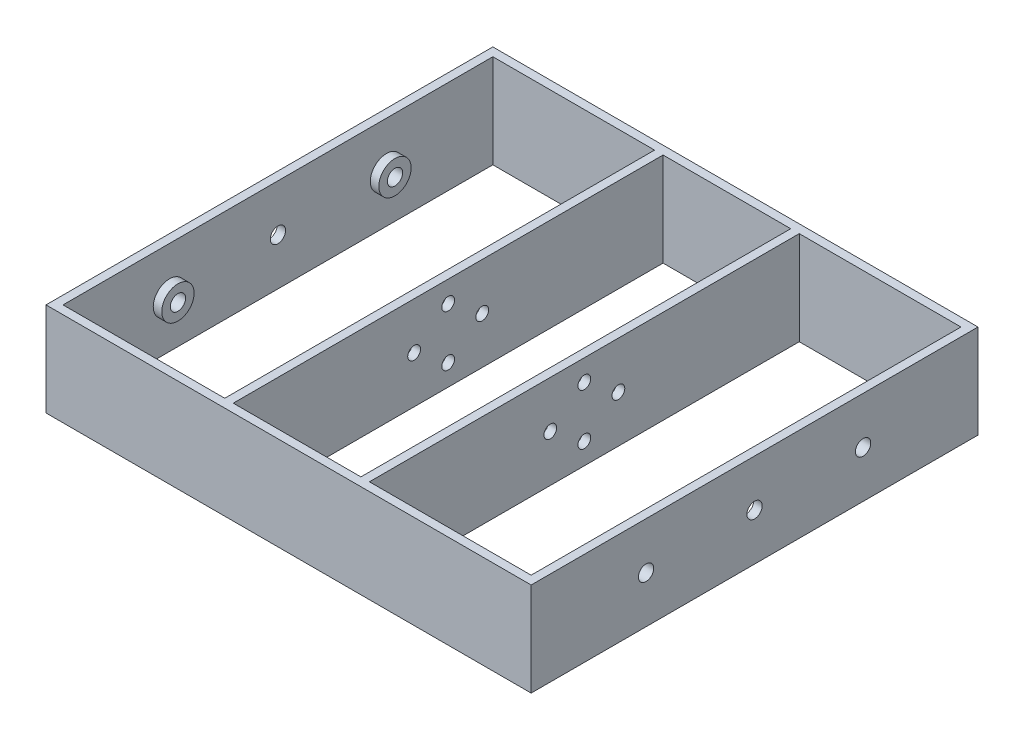
ISO-10303-21;
HEADER;
FILE_DESCRIPTION(('STEP AP214'),'2;1');
FILE_NAME('part.step','',(''),(''),'','','');
FILE_SCHEMA(('AUTOMOTIVE_DESIGN { 1 0 10303 214 1 1 1 1 }'));
ENDSEC;
DATA;
#1=APPLICATION_CONTEXT('core data for automotive mechanical design processes');
#2=APPLICATION_PROTOCOL_DEFINITION('international standard','automotive_design',2000,#1);
#3=PRODUCT_CONTEXT('',#1,'mechanical');
#4=PRODUCT('Part','Part','',(#3));
#5=PRODUCT_RELATED_PRODUCT_CATEGORY('part','',(#4));
#6=PRODUCT_DEFINITION_FORMATION('','',#4);
#7=PRODUCT_DEFINITION_CONTEXT('part definition',#1,'design');
#8=PRODUCT_DEFINITION('design','',#6,#7);
#9=PRODUCT_DEFINITION_SHAPE('','',#8);
#10=(LENGTH_UNIT() NAMED_UNIT(*) SI_UNIT(.MILLI.,.METRE.));
#11=(NAMED_UNIT(*) PLANE_ANGLE_UNIT() SI_UNIT($,.RADIAN.));
#12=(NAMED_UNIT(*) SI_UNIT($,.STERADIAN.) SOLID_ANGLE_UNIT());
#13=UNCERTAINTY_MEASURE_WITH_UNIT(LENGTH_MEASURE(1.E-05),#10,'distance_accuracy_value','');
#14=(GEOMETRIC_REPRESENTATION_CONTEXT(3) GLOBAL_UNCERTAINTY_ASSIGNED_CONTEXT((#13)) GLOBAL_UNIT_ASSIGNED_CONTEXT((#10,
#11,#12)) REPRESENTATION_CONTEXT('',''));
#15=CARTESIAN_POINT('',(0.,0.,0.));
#16=DIRECTION('',(0.,0.,1.));
#17=DIRECTION('',(1.,0.,0.));
#18=AXIS2_PLACEMENT_3D('',#15,#16,#17);
#19=CARTESIAN_POINT('',(-55.,0.,0.));
#20=DIRECTION('',(1.,0.,0.));
#21=DIRECTION('',(0.,0.,1.));
#22=AXIS2_PLACEMENT_3D('',#19,#20,#21);
#23=PLANE('',#22);
#24=CARTESIAN_POINT('',(-55.,0.,-25.5));
#25=DIRECTION('',(-1.,0.,0.));
#26=DIRECTION('',(0.,0.,1.));
#27=AXIS2_PLACEMENT_3D('',#24,#25,#26);
#28=CIRCLE('',#27,3.8);
#29=CARTESIAN_POINT('',(-55.,0.,-21.7));
#30=VERTEX_POINT('',#29);
#31=EDGE_CURVE('E288',#30,#30,#28,.T.);
#32=ORIENTED_EDGE('',*,*,#31,.T.);
#33=EDGE_LOOP('',(#32));
#34=FACE_BOUND('',#33,.T.);
#35=CARTESIAN_POINT('',(-55.,0.,0.));
#36=DIRECTION('',(1.,0.,0.));
#37=DIRECTION('',(0.,0.,-1.));
#38=AXIS2_PLACEMENT_3D('',#35,#36,#37);
#39=CIRCLE('',#38,1.8);
#40=CARTESIAN_POINT('',(-55.,0.,-1.8));
#41=VERTEX_POINT('',#40);
#42=EDGE_CURVE('E300',#41,#41,#39,.T.);
#43=ORIENTED_EDGE('',*,*,#42,.F.);
#44=EDGE_LOOP('',(#43));
#45=FACE_BOUND('',#44,.T.);
#46=CARTESIAN_POINT('',(-55.,0.,25.5));
#47=DIRECTION('',(-1.,0.,0.));
#48=DIRECTION('',(0.,0.,1.));
#49=AXIS2_PLACEMENT_3D('',#46,#47,#48);
#50=CIRCLE('',#49,3.8);
#51=CARTESIAN_POINT('',(-55.,0.,29.3));
#52=VERTEX_POINT('',#51);
#53=EDGE_CURVE('E279',#52,#52,#50,.T.);
#54=ORIENTED_EDGE('',*,*,#53,.T.);
#55=EDGE_LOOP('',(#54));
#56=FACE_BOUND('',#55,.T.);
#57=DIRECTION('',(0.,0.,-1.));
#58=VECTOR('',#57,1.);
#59=CARTESIAN_POINT('',(-55.,-11.,-52.5));
#60=LINE('',#59,#58);
#61=CARTESIAN_POINT('',(-55.,-11.,50.5));
#62=VERTEX_POINT('',#61);
#63=CARTESIAN_POINT('',(-55.,-11.,-50.5));
#64=VERTEX_POINT('',#63);
#65=EDGE_CURVE('E48',#62,#64,#60,.T.);
#66=ORIENTED_EDGE('',*,*,#65,.T.);
#67=DIRECTION('',(0.,1.,0.));
#68=VECTOR('',#67,1.);
#69=CARTESIAN_POINT('',(-55.,0.,-50.5));
#70=LINE('',#69,#68);
#71=CARTESIAN_POINT('',(-55.,11.,-50.5));
#72=VERTEX_POINT('',#71);
#73=EDGE_CURVE('E52',#64,#72,#70,.T.);
#74=ORIENTED_EDGE('',*,*,#73,.T.);
#75=DIRECTION('',(0.,0.,1.));
#76=VECTOR('',#75,1.);
#77=CARTESIAN_POINT('',(-55.,11.,-52.5));
#78=LINE('',#77,#76);
#79=CARTESIAN_POINT('',(-55.,11.,50.5));
#80=VERTEX_POINT('',#79);
#81=EDGE_CURVE('E310',#72,#80,#78,.T.);
#82=ORIENTED_EDGE('',*,*,#81,.T.);
#83=DIRECTION('',(0.,-1.,0.));
#84=VECTOR('',#83,1.);
#85=CARTESIAN_POINT('',(-55.,0.,50.5));
#86=LINE('',#85,#84);
#87=EDGE_CURVE('E274',#80,#62,#86,.T.);
#88=ORIENTED_EDGE('',*,*,#87,.T.);
#89=EDGE_LOOP('',(#66,#74,#82,#88));
#90=FACE_BOUND('',#89,.T.);
#91=ADVANCED_FACE('F33',(#34,#45,#56,#90),#23,.T.);
#92=CARTESIAN_POINT('',(55.,0.,0.));
#93=DIRECTION('',(-1.,0.,0.));
#94=DIRECTION('',(0.,0.,1.));
#95=AXIS2_PLACEMENT_3D('',#92,#93,#94);
#96=PLANE('',#95);
#97=CARTESIAN_POINT('',(55.,0.,25.5));
#98=DIRECTION('',(-1.,0.,0.));
#99=DIRECTION('',(0.,0.,1.));
#100=AXIS2_PLACEMENT_3D('',#97,#98,#99);
#101=CIRCLE('',#100,3.8);
#102=CARTESIAN_POINT('',(55.,0.,29.3));
#103=VERTEX_POINT('',#102);
#104=EDGE_CURVE('E221',#103,#103,#101,.T.);
#105=ORIENTED_EDGE('',*,*,#104,.F.);
#106=EDGE_LOOP('',(#105));
#107=FACE_BOUND('',#106,.T.);
#108=CARTESIAN_POINT('',(55.,0.,0.));
#109=DIRECTION('',(1.,0.,0.));
#110=DIRECTION('',(0.,0.,-1.));
#111=AXIS2_PLACEMENT_3D('',#108,#109,#110);
#112=CIRCLE('',#111,1.8);
#113=CARTESIAN_POINT('',(55.,0.,-1.8));
#114=VERTEX_POINT('',#113);
#115=EDGE_CURVE('E242',#114,#114,#112,.T.);
#116=ORIENTED_EDGE('',*,*,#115,.T.);
#117=EDGE_LOOP('',(#116));
#118=FACE_BOUND('',#117,.T.);
#119=CARTESIAN_POINT('',(55.,0.,-25.5));
#120=DIRECTION('',(-1.,0.,0.));
#121=DIRECTION('',(0.,0.,1.));
#122=AXIS2_PLACEMENT_3D('',#119,#120,#121);
#123=CIRCLE('',#122,3.8);
#124=CARTESIAN_POINT('',(55.,0.,-21.7));
#125=VERTEX_POINT('',#124);
#126=EDGE_CURVE('E230',#125,#125,#123,.T.);
#127=ORIENTED_EDGE('',*,*,#126,.F.);
#128=EDGE_LOOP('',(#127));
#129=FACE_BOUND('',#128,.T.);
#130=DIRECTION('',(0.,0.,1.));
#131=VECTOR('',#130,1.);
#132=CARTESIAN_POINT('',(55.,11.,-52.5));
#133=LINE('',#132,#131);
#134=CARTESIAN_POINT('',(55.,11.,-50.5));
#135=VERTEX_POINT('',#134);
#136=CARTESIAN_POINT('',(55.,11.,50.5));
#137=VERTEX_POINT('',#136);
#138=EDGE_CURVE('E253',#135,#137,#133,.T.);
#139=ORIENTED_EDGE('',*,*,#138,.F.);
#140=DIRECTION('',(0.,-1.,0.));
#141=VECTOR('',#140,1.);
#142=CARTESIAN_POINT('',(55.,0.,-50.5));
#143=LINE('',#142,#141);
#144=CARTESIAN_POINT('',(55.,-11.,-50.5));
#145=VERTEX_POINT('',#144);
#146=EDGE_CURVE('E357',#135,#145,#143,.T.);
#147=ORIENTED_EDGE('',*,*,#146,.T.);
#148=DIRECTION('',(0.,0.,-1.));
#149=VECTOR('',#148,1.);
#150=CARTESIAN_POINT('',(55.,-11.,-52.5));
#151=LINE('',#150,#149);
#152=CARTESIAN_POINT('',(55.,-11.,50.5));
#153=VERTEX_POINT('',#152);
#154=EDGE_CURVE('E246',#153,#145,#151,.T.);
#155=ORIENTED_EDGE('',*,*,#154,.F.);
#156=DIRECTION('',(0.,-1.,0.));
#157=VECTOR('',#156,1.);
#158=CARTESIAN_POINT('',(55.,11.,50.5));
#159=LINE('',#158,#157);
#160=EDGE_CURVE('E327',#137,#153,#159,.T.);
#161=ORIENTED_EDGE('',*,*,#160,.F.);
#162=EDGE_LOOP('',(#139,#147,#155,#161));
#163=FACE_BOUND('',#162,.T.);
#164=ADVANCED_FACE('F349',(#107,#118,#129,#163),#96,.T.);
#165=CARTESIAN_POINT('',(17.,0.,0.));
#166=DIRECTION('',(1.,0.,0.));
#167=DIRECTION('',(0.,0.,-1.));
#168=AXIS2_PLACEMENT_3D('',#165,#166,#167);
#169=PLANE('',#168);
#170=CARTESIAN_POINT('',(17.,-6.,0.));
#171=DIRECTION('',(1.,0.,0.));
#172=DIRECTION('',(0.,0.,-1.));
#173=AXIS2_PLACEMENT_3D('',#170,#171,#172);
#174=CIRCLE('',#173,1.5);
#175=CARTESIAN_POINT('',(17.,-6.,-1.5));
#176=VERTEX_POINT('',#175);
#177=EDGE_CURVE('E186',#176,#176,#174,.T.);
#178=ORIENTED_EDGE('',*,*,#177,.F.);
#179=EDGE_LOOP('',(#178));
#180=FACE_BOUND('',#179,.T.);
#181=CARTESIAN_POINT('',(17.,0.,8.));
#182=DIRECTION('',(1.,0.,0.));
#183=DIRECTION('',(0.,0.,-1.));
#184=AXIS2_PLACEMENT_3D('',#181,#182,#183);
#185=CIRCLE('',#184,1.5);
#186=CARTESIAN_POINT('',(17.,0.,6.5));
#187=VERTEX_POINT('',#186);
#188=EDGE_CURVE('E198',#187,#187,#185,.T.);
#189=ORIENTED_EDGE('',*,*,#188,.F.);
#190=EDGE_LOOP('',(#189));
#191=FACE_BOUND('',#190,.T.);
#192=CARTESIAN_POINT('',(17.,0.,-8.));
#193=DIRECTION('',(1.,0.,0.));
#194=DIRECTION('',(0.,0.,-1.));
#195=AXIS2_PLACEMENT_3D('',#192,#193,#194);
#196=CIRCLE('',#195,1.5);
#197=CARTESIAN_POINT('',(17.,0.,-9.5));
#198=VERTEX_POINT('',#197);
#199=EDGE_CURVE('E204',#198,#198,#196,.T.);
#200=ORIENTED_EDGE('',*,*,#199,.F.);
#201=EDGE_LOOP('',(#200));
#202=FACE_BOUND('',#201,.T.);
#203=CARTESIAN_POINT('',(17.,6.,0.));
#204=DIRECTION('',(1.,0.,0.));
#205=DIRECTION('',(0.,0.,-1.));
#206=AXIS2_PLACEMENT_3D('',#203,#204,#205);
#207=CIRCLE('',#206,1.5);
#208=CARTESIAN_POINT('',(17.,6.,-1.5));
#209=VERTEX_POINT('',#208);
#210=EDGE_CURVE('E192',#209,#209,#207,.T.);
#211=ORIENTED_EDGE('',*,*,#210,.F.);
#212=EDGE_LOOP('',(#211));
#213=FACE_BOUND('',#212,.T.);
#214=DIRECTION('',(0.,0.,-1.));
#215=VECTOR('',#214,1.);
#216=CARTESIAN_POINT('',(17.,-11.,-52.5));
#217=LINE('',#216,#215);
#218=CARTESIAN_POINT('',(17.,-11.,50.5));
#219=VERTEX_POINT('',#218);
#220=CARTESIAN_POINT('',(17.,-11.,-50.5));
#221=VERTEX_POINT('',#220);
#222=EDGE_CURVE('E210',#219,#221,#217,.T.);
#223=ORIENTED_EDGE('',*,*,#222,.T.);
#224=DIRECTION('',(0.,1.,0.));
#225=VECTOR('',#224,1.);
#226=CARTESIAN_POINT('',(17.,0.,-50.5));
#227=LINE('',#226,#225);
#228=CARTESIAN_POINT('',(17.,11.,-50.5));
#229=VERTEX_POINT('',#228);
#230=EDGE_CURVE('E354',#221,#229,#227,.T.);
#231=ORIENTED_EDGE('',*,*,#230,.T.);
#232=DIRECTION('',(0.,0.,1.));
#233=VECTOR('',#232,1.);
#234=CARTESIAN_POINT('',(17.,11.,-52.5));
#235=LINE('',#234,#233);
#236=CARTESIAN_POINT('',(17.,11.,50.5));
#237=VERTEX_POINT('',#236);
#238=EDGE_CURVE('E212',#229,#237,#235,.T.);
#239=ORIENTED_EDGE('',*,*,#238,.T.);
#240=DIRECTION('',(0.,1.,0.));
#241=VECTOR('',#240,1.);
#242=CARTESIAN_POINT('',(17.,11.,50.5));
#243=LINE('',#242,#241);
#244=EDGE_CURVE('E41',#219,#237,#243,.T.);
#245=ORIENTED_EDGE('',*,*,#244,.F.);
#246=EDGE_LOOP('',(#223,#231,#239,#245));
#247=FACE_BOUND('',#246,.T.);
#248=ADVANCED_FACE('F353',(#180,#191,#202,#213,#247),#169,.T.);
#249=CARTESIAN_POINT('',(15.,0.,0.));
#250=DIRECTION('',(1.,0.,0.));
#251=DIRECTION('',(0.,0.,-1.));
#252=AXIS2_PLACEMENT_3D('',#249,#250,#251);
#253=PLANE('',#252);
#254=CARTESIAN_POINT('',(15.,-6.,0.));
#255=DIRECTION('',(1.,0.,0.));
#256=DIRECTION('',(0.,0.,-1.));
#257=AXIS2_PLACEMENT_3D('',#254,#255,#256);
#258=CIRCLE('',#257,1.5);
#259=CARTESIAN_POINT('',(15.,-6.,-1.5));
#260=VERTEX_POINT('',#259);
#261=EDGE_CURVE('E185',#260,#260,#258,.T.);
#262=ORIENTED_EDGE('',*,*,#261,.T.);
#263=EDGE_LOOP('',(#262));
#264=FACE_BOUND('',#263,.T.);
#265=CARTESIAN_POINT('',(15.,6.,0.));
#266=DIRECTION('',(1.,0.,0.));
#267=DIRECTION('',(0.,0.,-1.));
#268=AXIS2_PLACEMENT_3D('',#265,#266,#267);
#269=CIRCLE('',#268,1.5);
#270=CARTESIAN_POINT('',(15.,6.,-1.5));
#271=VERTEX_POINT('',#270);
#272=EDGE_CURVE('E189',#271,#271,#269,.T.);
#273=ORIENTED_EDGE('',*,*,#272,.T.);
#274=EDGE_LOOP('',(#273));
#275=FACE_BOUND('',#274,.T.);
#276=CARTESIAN_POINT('',(15.,0.,8.));
#277=DIRECTION('',(1.,0.,0.));
#278=DIRECTION('',(0.,0.,-1.));
#279=AXIS2_PLACEMENT_3D('',#276,#277,#278);
#280=CIRCLE('',#279,1.5);
#281=CARTESIAN_POINT('',(15.,0.,6.5));
#282=VERTEX_POINT('',#281);
#283=EDGE_CURVE('E195',#282,#282,#280,.T.);
#284=ORIENTED_EDGE('',*,*,#283,.T.);
#285=EDGE_LOOP('',(#284));
#286=FACE_BOUND('',#285,.T.);
#287=CARTESIAN_POINT('',(15.,0.,-8.));
#288=DIRECTION('',(1.,0.,0.));
#289=DIRECTION('',(0.,0.,-1.));
#290=AXIS2_PLACEMENT_3D('',#287,#288,#289);
#291=CIRCLE('',#290,1.5);
#292=CARTESIAN_POINT('',(15.,0.,-9.5));
#293=VERTEX_POINT('',#292);
#294=EDGE_CURVE('E201',#293,#293,#291,.T.);
#295=ORIENTED_EDGE('',*,*,#294,.T.);
#296=EDGE_LOOP('',(#295));
#297=FACE_BOUND('',#296,.T.);
#298=DIRECTION('',(0.,1.,0.));
#299=VECTOR('',#298,1.);
#300=CARTESIAN_POINT('',(15.,0.,-50.5));
#301=LINE('',#300,#299);
#302=CARTESIAN_POINT('',(15.,-11.,-50.5));
#303=VERTEX_POINT('',#302);
#304=CARTESIAN_POINT('',(15.,11.,-50.5));
#305=VERTEX_POINT('',#304);
#306=EDGE_CURVE('E163',#303,#305,#301,.T.);
#307=ORIENTED_EDGE('',*,*,#306,.F.);
#308=DIRECTION('',(0.,0.,-1.));
#309=VECTOR('',#308,1.);
#310=CARTESIAN_POINT('',(15.,-11.,-52.5));
#311=LINE('',#310,#309);
#312=CARTESIAN_POINT('',(15.,-11.,50.5));
#313=VERTEX_POINT('',#312);
#314=EDGE_CURVE('E207',#313,#303,#311,.T.);
#315=ORIENTED_EDGE('',*,*,#314,.F.);
#316=DIRECTION('',(0.,1.,0.));
#317=VECTOR('',#316,1.);
#318=CARTESIAN_POINT('',(15.,11.,50.5));
#319=LINE('',#318,#317);
#320=CARTESIAN_POINT('',(15.,11.,50.5));
#321=VERTEX_POINT('',#320);
#322=EDGE_CURVE('E330',#313,#321,#319,.T.);
#323=ORIENTED_EDGE('',*,*,#322,.T.);
#324=DIRECTION('',(0.,0.,1.));
#325=VECTOR('',#324,1.);
#326=CARTESIAN_POINT('',(15.,11.,-52.5));
#327=LINE('',#326,#325);
#328=EDGE_CURVE('E213',#305,#321,#327,.T.);
#329=ORIENTED_EDGE('',*,*,#328,.F.);
#330=EDGE_LOOP('',(#307,#315,#323,#329));
#331=FACE_BOUND('',#330,.T.);
#332=ADVANCED_FACE('F410',(#264,#275,#286,#297,#331),#253,.F.);
#333=CARTESIAN_POINT('',(-17.,0.,0.));
#334=DIRECTION('',(-1.,0.,0.));
#335=DIRECTION('',(0.,0.,-1.));
#336=AXIS2_PLACEMENT_3D('',#333,#334,#335);
#337=PLANE('',#336);
#338=CARTESIAN_POINT('',(-17.,-6.,0.));
#339=DIRECTION('',(1.,0.,0.));
#340=DIRECTION('',(0.,0.,-1.));
#341=AXIS2_PLACEMENT_3D('',#338,#339,#340);
#342=CIRCLE('',#341,1.5);
#343=CARTESIAN_POINT('',(-17.,-6.,-1.5));
#344=VERTEX_POINT('',#343);
#345=EDGE_CURVE('E364',#344,#344,#342,.T.);
#346=ORIENTED_EDGE('',*,*,#345,.T.);
#347=EDGE_LOOP('',(#346));
#348=FACE_BOUND('',#347,.T.);
#349=CARTESIAN_POINT('',(-17.,0.,8.));
#350=DIRECTION('',(1.,0.,0.));
#351=DIRECTION('',(0.,0.,-1.));
#352=AXIS2_PLACEMENT_3D('',#349,#350,#351);
#353=CIRCLE('',#352,1.5);
#354=CARTESIAN_POINT('',(-17.,0.,6.5));
#355=VERTEX_POINT('',#354);
#356=EDGE_CURVE('E376',#355,#355,#353,.T.);
#357=ORIENTED_EDGE('',*,*,#356,.T.);
#358=EDGE_LOOP('',(#357));
#359=FACE_BOUND('',#358,.T.);
#360=CARTESIAN_POINT('',(-17.,0.,-8.));
#361=DIRECTION('',(1.,0.,0.));
#362=DIRECTION('',(0.,0.,-1.));
#363=AXIS2_PLACEMENT_3D('',#360,#361,#362);
#364=CIRCLE('',#363,1.5);
#365=CARTESIAN_POINT('',(-17.,0.,-9.5));
#366=VERTEX_POINT('',#365);
#367=EDGE_CURVE('E180',#366,#366,#364,.T.);
#368=ORIENTED_EDGE('',*,*,#367,.T.);
#369=EDGE_LOOP('',(#368));
#370=FACE_BOUND('',#369,.T.);
#371=CARTESIAN_POINT('',(-17.,6.,0.));
#372=DIRECTION('',(1.,0.,0.));
#373=DIRECTION('',(0.,0.,-1.));
#374=AXIS2_PLACEMENT_3D('',#371,#372,#373);
#375=CIRCLE('',#374,1.5);
#376=CARTESIAN_POINT('',(-17.,6.,-1.5));
#377=VERTEX_POINT('',#376);
#378=EDGE_CURVE('E370',#377,#377,#375,.T.);
#379=ORIENTED_EDGE('',*,*,#378,.T.);
#380=EDGE_LOOP('',(#379));
#381=FACE_BOUND('',#380,.T.);
#382=DIRECTION('',(0.,0.,1.));
#383=VECTOR('',#382,1.);
#384=CARTESIAN_POINT('',(-17.,11.,-52.5));
#385=LINE('',#384,#383);
#386=CARTESIAN_POINT('',(-17.,11.,-50.5));
#387=VERTEX_POINT('',#386);
#388=CARTESIAN_POINT('',(-17.,11.,50.5));
#389=VERTEX_POINT('',#388);
#390=EDGE_CURVE('E162',#387,#389,#385,.T.);
#391=ORIENTED_EDGE('',*,*,#390,.F.);
#392=DIRECTION('',(0.,-1.,0.));
#393=VECTOR('',#392,1.);
#394=CARTESIAN_POINT('',(-17.,0.,-50.5));
#395=LINE('',#394,#393);
#396=CARTESIAN_POINT('',(-17.,-11.,-50.5));
#397=VERTEX_POINT('',#396);
#398=EDGE_CURVE('E148',#387,#397,#395,.T.);
#399=ORIENTED_EDGE('',*,*,#398,.T.);
#400=DIRECTION('',(0.,0.,-1.));
#401=VECTOR('',#400,1.);
#402=CARTESIAN_POINT('',(-17.,-11.,-52.5));
#403=LINE('',#402,#401);
#404=CARTESIAN_POINT('',(-17.,-11.,50.5));
#405=VERTEX_POINT('',#404);
#406=EDGE_CURVE('E160',#405,#397,#403,.T.);
#407=ORIENTED_EDGE('',*,*,#406,.F.);
#408=DIRECTION('',(0.,-1.,0.));
#409=VECTOR('',#408,1.);
#410=CARTESIAN_POINT('',(-17.,11.,50.5));
#411=LINE('',#410,#409);
#412=EDGE_CURVE('E183',#389,#405,#411,.T.);
#413=ORIENTED_EDGE('',*,*,#412,.F.);
#414=EDGE_LOOP('',(#391,#399,#407,#413));
#415=FACE_BOUND('',#414,.T.);
#416=ADVANCED_FACE('F158',(#348,#359,#370,#381,#415),#337,.T.);
#417=CARTESIAN_POINT('',(-15.,0.,0.));
#418=DIRECTION('',(-1.,0.,0.));
#419=DIRECTION('',(0.,0.,-1.));
#420=AXIS2_PLACEMENT_3D('',#417,#418,#419);
#421=PLANE('',#420);
#422=CARTESIAN_POINT('',(-15.,-6.,0.));
#423=DIRECTION('',(1.,0.,0.));
#424=DIRECTION('',(0.,0.,-1.));
#425=AXIS2_PLACEMENT_3D('',#422,#423,#424);
#426=CIRCLE('',#425,1.5);
#427=CARTESIAN_POINT('',(-15.,-6.,-1.5));
#428=VERTEX_POINT('',#427);
#429=EDGE_CURVE('E363',#428,#428,#426,.T.);
#430=ORIENTED_EDGE('',*,*,#429,.F.);
#431=EDGE_LOOP('',(#430));
#432=FACE_BOUND('',#431,.T.);
#433=CARTESIAN_POINT('',(-15.,6.,0.));
#434=DIRECTION('',(1.,0.,0.));
#435=DIRECTION('',(0.,0.,-1.));
#436=AXIS2_PLACEMENT_3D('',#433,#434,#435);
#437=CIRCLE('',#436,1.5);
#438=CARTESIAN_POINT('',(-15.,6.,-1.5));
#439=VERTEX_POINT('',#438);
#440=EDGE_CURVE('E367',#439,#439,#437,.T.);
#441=ORIENTED_EDGE('',*,*,#440,.F.);
#442=EDGE_LOOP('',(#441));
#443=FACE_BOUND('',#442,.T.);
#444=CARTESIAN_POINT('',(-15.,0.,8.));
#445=DIRECTION('',(1.,0.,0.));
#446=DIRECTION('',(0.,0.,-1.));
#447=AXIS2_PLACEMENT_3D('',#444,#445,#446);
#448=CIRCLE('',#447,1.5);
#449=CARTESIAN_POINT('',(-15.,0.,6.5));
#450=VERTEX_POINT('',#449);
#451=EDGE_CURVE('E373',#450,#450,#448,.T.);
#452=ORIENTED_EDGE('',*,*,#451,.F.);
#453=EDGE_LOOP('',(#452));
#454=FACE_BOUND('',#453,.T.);
#455=CARTESIAN_POINT('',(-15.,0.,-8.));
#456=DIRECTION('',(1.,0.,0.));
#457=DIRECTION('',(0.,0.,-1.));
#458=AXIS2_PLACEMENT_3D('',#455,#456,#457);
#459=CIRCLE('',#458,1.5);
#460=CARTESIAN_POINT('',(-15.,0.,-9.5));
#461=VERTEX_POINT('',#460);
#462=EDGE_CURVE('E177',#461,#461,#459,.T.);
#463=ORIENTED_EDGE('',*,*,#462,.F.);
#464=EDGE_LOOP('',(#463));
#465=FACE_BOUND('',#464,.T.);
#466=DIRECTION('',(0.,-1.,0.));
#467=VECTOR('',#466,1.);
#468=CARTESIAN_POINT('',(-15.,0.,-50.5));
#469=LINE('',#468,#467);
#470=CARTESIAN_POINT('',(-15.,11.,-50.5));
#471=VERTEX_POINT('',#470);
#472=CARTESIAN_POINT('',(-15.,-11.,-50.5));
#473=VERTEX_POINT('',#472);
#474=EDGE_CURVE('E11',#471,#473,#469,.T.);
#475=ORIENTED_EDGE('',*,*,#474,.F.);
#476=DIRECTION('',(0.,0.,1.));
#477=VECTOR('',#476,1.);
#478=CARTESIAN_POINT('',(-15.,11.,-52.5));
#479=LINE('',#478,#477);
#480=CARTESIAN_POINT('',(-15.,11.,50.5));
#481=VERTEX_POINT('',#480);
#482=EDGE_CURVE('E170',#471,#481,#479,.T.);
#483=ORIENTED_EDGE('',*,*,#482,.T.);
#484=DIRECTION('',(0.,-1.,0.));
#485=VECTOR('',#484,1.);
#486=CARTESIAN_POINT('',(-15.,11.,50.5));
#487=LINE('',#486,#485);
#488=CARTESIAN_POINT('',(-15.,-11.,50.5));
#489=VERTEX_POINT('',#488);
#490=EDGE_CURVE('E172',#481,#489,#487,.T.);
#491=ORIENTED_EDGE('',*,*,#490,.T.);
#492=DIRECTION('',(0.,0.,-1.));
#493=VECTOR('',#492,1.);
#494=CARTESIAN_POINT('',(-15.,-11.,-52.5));
#495=LINE('',#494,#493);
#496=EDGE_CURVE('E174',#489,#473,#495,.T.);
#497=ORIENTED_EDGE('',*,*,#496,.T.);
#498=EDGE_LOOP('',(#475,#483,#491,#497));
#499=FACE_BOUND('',#498,.T.);
#500=ADVANCED_FACE('F388',(#432,#443,#454,#465,#499),#421,.F.);
#501=CARTESIAN_POINT('',(-57.,11.,50.5));
#502=DIRECTION('',(0.,0.,1.));
#503=DIRECTION('',(1.,0.,0.));
#504=AXIS2_PLACEMENT_3D('',#501,#502,#503);
#505=PLANE('',#504);
#506=ORIENTED_EDGE('',*,*,#490,.F.);
#507=DIRECTION('',(-1.,0.,0.));
#508=VECTOR('',#507,1.);
#509=CARTESIAN_POINT('',(-57.,11.,50.5));
#510=LINE('',#509,#508);
#511=EDGE_CURVE('E266',#321,#481,#510,.T.);
#512=ORIENTED_EDGE('',*,*,#511,.F.);
#513=ORIENTED_EDGE('',*,*,#322,.F.);
#514=DIRECTION('',(-1.,0.,0.));
#515=VECTOR('',#514,1.);
#516=CARTESIAN_POINT('',(-57.,-11.,50.5));
#517=LINE('',#516,#515);
#518=EDGE_CURVE('E271',#313,#489,#517,.T.);
#519=ORIENTED_EDGE('',*,*,#518,.T.);
#520=EDGE_LOOP('',(#506,#512,#513,#519));
#521=FACE_BOUND('',#520,.T.);
#522=ADVANCED_FACE('F391',(#521),#505,.F.);
#523=EDGE_CURVE('E260',#389,#80,#510,.T.);
#524=ORIENTED_EDGE('',*,*,#523,.F.);
#525=ORIENTED_EDGE('',*,*,#412,.T.);
#526=EDGE_CURVE('E169',#405,#62,#517,.T.);
#527=ORIENTED_EDGE('',*,*,#526,.T.);
#528=ORIENTED_EDGE('',*,*,#87,.F.);
#529=EDGE_LOOP('',(#524,#525,#527,#528));
#530=FACE_BOUND('',#529,.T.);
#531=ADVANCED_FACE('F419',(#530),#505,.F.);
#532=CARTESIAN_POINT('',(-57.,0.,0.));
#533=DIRECTION('',(1.,0.,0.));
#534=DIRECTION('',(0.,0.,1.));
#535=AXIS2_PLACEMENT_3D('',#532,#533,#534);
#536=PLANE('',#535);
#537=DIRECTION('',(0.,1.,0.));
#538=VECTOR('',#537,1.);
#539=CARTESIAN_POINT('',(-57.,11.,-52.5));
#540=LINE('',#539,#538);
#541=CARTESIAN_POINT('',(-57.,-11.,-52.5));
#542=VERTEX_POINT('',#541);
#543=CARTESIAN_POINT('',(-57.,11.,-52.5));
#544=VERTEX_POINT('',#543);
#545=EDGE_CURVE('E312',#542,#544,#540,.T.);
#546=ORIENTED_EDGE('',*,*,#545,.F.);
#547=DIRECTION('',(0.,0.,-1.));
#548=VECTOR('',#547,1.);
#549=CARTESIAN_POINT('',(-57.,-11.,-52.5));
#550=LINE('',#549,#548);
#551=CARTESIAN_POINT('',(-57.,-11.,52.5));
#552=VERTEX_POINT('',#551);
#553=EDGE_CURVE('E309',#552,#542,#550,.T.);
#554=ORIENTED_EDGE('',*,*,#553,.F.);
#555=DIRECTION('',(0.,-1.,0.));
#556=VECTOR('',#555,1.);
#557=CARTESIAN_POINT('',(-57.,11.,52.5));
#558=LINE('',#557,#556);
#559=CARTESIAN_POINT('',(-57.,11.,52.5));
#560=VERTEX_POINT('',#559);
#561=EDGE_CURVE('E306',#560,#552,#558,.T.);
#562=ORIENTED_EDGE('',*,*,#561,.F.);
#563=DIRECTION('',(0.,0.,1.));
#564=VECTOR('',#563,1.);
#565=CARTESIAN_POINT('',(-57.,11.,-52.5));
#566=LINE('',#565,#564);
#567=EDGE_CURVE('E315',#544,#560,#566,.T.);
#568=ORIENTED_EDGE('',*,*,#567,.F.);
#569=EDGE_LOOP('',(#546,#554,#562,#568));
#570=FACE_BOUND('',#569,.T.);
#571=CARTESIAN_POINT('',(-57.,0.,0.));
#572=DIRECTION('',(1.,0.,0.));
#573=DIRECTION('',(0.,0.,-1.));
#574=AXIS2_PLACEMENT_3D('',#571,#572,#573);
#575=CIRCLE('',#574,1.8);
#576=CARTESIAN_POINT('',(-57.,0.,-1.8));
#577=VERTEX_POINT('',#576);
#578=EDGE_CURVE('E301',#577,#577,#575,.T.);
#579=ORIENTED_EDGE('',*,*,#578,.T.);
#580=EDGE_LOOP('',(#579));
#581=FACE_BOUND('',#580,.T.);
#582=CARTESIAN_POINT('',(-57.,0.,25.5));
#583=DIRECTION('',(1.,0.,0.));
#584=DIRECTION('',(0.,0.,-1.));
#585=AXIS2_PLACEMENT_3D('',#582,#583,#584);
#586=CIRCLE('',#585,1.8);
#587=CARTESIAN_POINT('',(-57.,0.,23.7));
#588=VERTEX_POINT('',#587);
#589=EDGE_CURVE('E297',#588,#588,#586,.T.);
#590=ORIENTED_EDGE('',*,*,#589,.T.);
#591=EDGE_LOOP('',(#590));
#592=FACE_BOUND('',#591,.T.);
#593=CARTESIAN_POINT('',(-57.,0.,-25.5));
#594=DIRECTION('',(1.,0.,0.));
#595=DIRECTION('',(0.,0.,-1.));
#596=AXIS2_PLACEMENT_3D('',#593,#594,#595);
#597=CIRCLE('',#596,1.8);
#598=CARTESIAN_POINT('',(-57.,0.,-27.3));
#599=VERTEX_POINT('',#598);
#600=EDGE_CURVE('E292',#599,#599,#597,.T.);
#601=ORIENTED_EDGE('',*,*,#600,.T.);
#602=EDGE_LOOP('',(#601));
#603=FACE_BOUND('',#602,.T.);
#604=ADVANCED_FACE('F445',(#570,#581,#592,#603),#536,.F.);
#605=CARTESIAN_POINT('',(-57.,11.,52.5));
#606=DIRECTION('',(0.,0.,-1.));
#607=DIRECTION('',(1.,0.,0.));
#608=AXIS2_PLACEMENT_3D('',#605,#606,#607);
#609=PLANE('',#608);
#610=DIRECTION('',(1.,0.,0.));
#611=VECTOR('',#610,1.);
#612=CARTESIAN_POINT('',(-57.,-11.,52.5));
#613=LINE('',#612,#611);
#614=CARTESIAN_POINT('',(57.,-11.,52.5));
#615=VERTEX_POINT('',#614);
#616=EDGE_CURVE('E325',#552,#615,#613,.T.);
#617=ORIENTED_EDGE('',*,*,#616,.T.);
#618=DIRECTION('',(0.,-1.,0.));
#619=VECTOR('',#618,1.);
#620=CARTESIAN_POINT('',(57.,11.,52.5));
#621=LINE('',#620,#619);
#622=CARTESIAN_POINT('',(57.,11.,52.5));
#623=VERTEX_POINT('',#622);
#624=EDGE_CURVE('E265',#623,#615,#621,.T.);
#625=ORIENTED_EDGE('',*,*,#624,.F.);
#626=DIRECTION('',(1.,0.,0.));
#627=VECTOR('',#626,1.);
#628=CARTESIAN_POINT('',(-57.,11.,52.5));
#629=LINE('',#628,#627);
#630=EDGE_CURVE('E317',#560,#623,#629,.T.);
#631=ORIENTED_EDGE('',*,*,#630,.F.);
#632=ORIENTED_EDGE('',*,*,#561,.T.);
#633=EDGE_LOOP('',(#617,#625,#631,#632));
#634=FACE_BOUND('',#633,.T.);
#635=ADVANCED_FACE('F35',(#634),#609,.F.);
#636=CARTESIAN_POINT('',(-57.,-11.,-52.5));
#637=DIRECTION('',(0.,1.,0.));
#638=DIRECTION('',(0.,0.,1.));
#639=AXIS2_PLACEMENT_3D('',#636,#637,#638);
#640=PLANE('',#639);
#641=DIRECTION('',(1.,0.,0.));
#642=VECTOR('',#641,1.);
#643=CARTESIAN_POINT('',(-57.,-11.,-50.5));
#644=LINE('',#643,#642);
#645=EDGE_CURVE('E144',#64,#397,#644,.T.);
#646=ORIENTED_EDGE('',*,*,#645,.F.);
#647=ORIENTED_EDGE('',*,*,#65,.F.);
#648=ORIENTED_EDGE('',*,*,#526,.F.);
#649=ORIENTED_EDGE('',*,*,#406,.T.);
#650=EDGE_LOOP('',(#646,#647,#648,#649));
#651=FACE_BOUND('',#650,.T.);
#652=ORIENTED_EDGE('',*,*,#154,.T.);
#653=EDGE_CURVE('E155',#221,#145,#644,.T.);
#654=ORIENTED_EDGE('',*,*,#653,.F.);
#655=ORIENTED_EDGE('',*,*,#222,.F.);
#656=EDGE_CURVE('E261',#153,#219,#517,.T.);
#657=ORIENTED_EDGE('',*,*,#656,.F.);
#658=EDGE_LOOP('',(#652,#654,#655,#657));
#659=FACE_BOUND('',#658,.T.);
#660=ORIENTED_EDGE('',*,*,#314,.T.);
#661=EDGE_CURVE('E153',#473,#303,#644,.T.);
#662=ORIENTED_EDGE('',*,*,#661,.F.);
#663=ORIENTED_EDGE('',*,*,#496,.F.);
#664=ORIENTED_EDGE('',*,*,#518,.F.);
#665=EDGE_LOOP('',(#660,#662,#663,#664));
#666=FACE_BOUND('',#665,.T.);
#667=DIRECTION('',(1.,0.,0.));
#668=VECTOR('',#667,1.);
#669=CARTESIAN_POINT('',(-57.,-11.,-52.5));
#670=LINE('',#669,#668);
#671=CARTESIAN_POINT('',(57.,-11.,-52.5));
#672=VERTEX_POINT('',#671);
#673=EDGE_CURVE('E323',#542,#672,#670,.T.);
#674=ORIENTED_EDGE('',*,*,#673,.T.);
#675=DIRECTION('',(0.,0.,-1.));
#676=VECTOR('',#675,1.);
#677=CARTESIAN_POINT('',(57.,-11.,52.5));
#678=LINE('',#677,#676);
#679=EDGE_CURVE('E252',#615,#672,#678,.T.);
#680=ORIENTED_EDGE('',*,*,#679,.F.);
#681=ORIENTED_EDGE('',*,*,#616,.F.);
#682=ORIENTED_EDGE('',*,*,#553,.T.);
#683=EDGE_LOOP('',(#674,#680,#681,#682));
#684=FACE_BOUND('',#683,.T.);
#685=ADVANCED_FACE('F167',(#651,#659,#666,#684),#640,.F.);
#686=CARTESIAN_POINT('',(-57.,11.,-52.5));
#687=DIRECTION('',(0.,0.,1.));
#688=DIRECTION('',(-1.,0.,0.));
#689=AXIS2_PLACEMENT_3D('',#686,#687,#688);
#690=PLANE('',#689);
#691=DIRECTION('',(1.,0.,0.));
#692=VECTOR('',#691,1.);
#693=CARTESIAN_POINT('',(-57.,11.,-52.5));
#694=LINE('',#693,#692);
#695=CARTESIAN_POINT('',(57.,11.,-52.5));
#696=VERTEX_POINT('',#695);
#697=EDGE_CURVE('E321',#544,#696,#694,.T.);
#698=ORIENTED_EDGE('',*,*,#697,.T.);
#699=DIRECTION('',(0.,1.,0.));
#700=VECTOR('',#699,1.);
#701=CARTESIAN_POINT('',(57.,11.,-52.5));
#702=LINE('',#701,#700);
#703=EDGE_CURVE('E249',#672,#696,#702,.T.);
#704=ORIENTED_EDGE('',*,*,#703,.F.);
#705=ORIENTED_EDGE('',*,*,#673,.F.);
#706=ORIENTED_EDGE('',*,*,#545,.T.);
#707=EDGE_LOOP('',(#698,#704,#705,#706));
#708=FACE_BOUND('',#707,.T.);
#709=ADVANCED_FACE('F424',(#708),#690,.F.);
#710=CARTESIAN_POINT('',(-57.,11.,-52.5));
#711=DIRECTION('',(0.,-1.,0.));
#712=DIRECTION('',(0.,0.,-1.));
#713=AXIS2_PLACEMENT_3D('',#710,#711,#712);
#714=PLANE('',#713);
#715=ORIENTED_EDGE('',*,*,#81,.F.);
#716=DIRECTION('',(1.,0.,0.));
#717=VECTOR('',#716,1.);
#718=CARTESIAN_POINT('',(-57.,11.,-50.5));
#719=LINE('',#718,#717);
#720=EDGE_CURVE('E164',#72,#387,#719,.T.);
#721=ORIENTED_EDGE('',*,*,#720,.T.);
#722=ORIENTED_EDGE('',*,*,#390,.T.);
#723=ORIENTED_EDGE('',*,*,#523,.T.);
#724=EDGE_LOOP('',(#715,#721,#722,#723));
#725=FACE_BOUND('',#724,.T.);
#726=ORIENTED_EDGE('',*,*,#482,.F.);
#727=EDGE_CURVE('E403',#471,#305,#719,.T.);
#728=ORIENTED_EDGE('',*,*,#727,.T.);
#729=ORIENTED_EDGE('',*,*,#328,.T.);
#730=ORIENTED_EDGE('',*,*,#511,.T.);
#731=EDGE_LOOP('',(#726,#728,#729,#730));
#732=FACE_BOUND('',#731,.T.);
#733=ORIENTED_EDGE('',*,*,#238,.F.);
#734=EDGE_CURVE('E152',#229,#135,#719,.T.);
#735=ORIENTED_EDGE('',*,*,#734,.T.);
#736=ORIENTED_EDGE('',*,*,#138,.T.);
#737=EDGE_CURVE('E262',#137,#237,#510,.T.);
#738=ORIENTED_EDGE('',*,*,#737,.T.);
#739=EDGE_LOOP('',(#733,#735,#736,#738));
#740=FACE_BOUND('',#739,.T.);
#741=DIRECTION('',(0.,0.,-1.));
#742=VECTOR('',#741,1.);
#743=CARTESIAN_POINT('',(57.,11.,52.5));
#744=LINE('',#743,#742);
#745=EDGE_CURVE('E257',#623,#696,#744,.T.);
#746=ORIENTED_EDGE('',*,*,#745,.T.);
#747=ORIENTED_EDGE('',*,*,#697,.F.);
#748=ORIENTED_EDGE('',*,*,#567,.T.);
#749=ORIENTED_EDGE('',*,*,#630,.T.);
#750=EDGE_LOOP('',(#746,#747,#748,#749));
#751=FACE_BOUND('',#750,.T.);
#752=ADVANCED_FACE('F341',(#725,#732,#740,#751),#714,.F.);
#753=CARTESIAN_POINT('',(-57.,0.,0.));
#754=DIRECTION('',(1.,0.,0.));
#755=DIRECTION('',(0.,0.,1.));
#756=AXIS2_PLACEMENT_3D('',#753,#754,#755);
#757=CYLINDRICAL_SURFACE('',#756,1.8);
#758=ORIENTED_EDGE('',*,*,#578,.F.);
#759=EDGE_LOOP('',(#758));
#760=FACE_BOUND('',#759,.T.);
#761=ORIENTED_EDGE('',*,*,#42,.T.);
#762=EDGE_LOOP('',(#761));
#763=FACE_BOUND('',#762,.T.);
#764=ADVANCED_FACE('F423',(#760,#763),#757,.F.);
#765=CARTESIAN_POINT('',(-57.,0.,25.5));
#766=DIRECTION('',(1.,0.,0.));
#767=DIRECTION('',(0.,0.,1.));
#768=AXIS2_PLACEMENT_3D('',#765,#766,#767);
#769=CYLINDRICAL_SURFACE('',#768,1.8);
#770=ORIENTED_EDGE('',*,*,#589,.F.);
#771=EDGE_LOOP('',(#770));
#772=FACE_BOUND('',#771,.T.);
#773=CARTESIAN_POINT('',(-53.,0.,25.5));
#774=DIRECTION('',(-1.,0.,0.));
#775=DIRECTION('',(0.,0.,1.));
#776=AXIS2_PLACEMENT_3D('',#773,#774,#775);
#777=CIRCLE('',#776,1.8);
#778=CARTESIAN_POINT('',(-53.,0.,27.3));
#779=VERTEX_POINT('',#778);
#780=EDGE_CURVE('E276',#779,#779,#777,.T.);
#781=ORIENTED_EDGE('',*,*,#780,.F.);
#782=EDGE_LOOP('',(#781));
#783=FACE_BOUND('',#782,.T.);
#784=ADVANCED_FACE('F430',(#772,#783),#769,.F.);
#785=CARTESIAN_POINT('',(-57.,0.,-25.5));
#786=DIRECTION('',(1.,0.,0.));
#787=DIRECTION('',(0.,0.,1.));
#788=AXIS2_PLACEMENT_3D('',#785,#786,#787);
#789=CYLINDRICAL_SURFACE('',#788,1.8);
#790=ORIENTED_EDGE('',*,*,#600,.F.);
#791=EDGE_LOOP('',(#790));
#792=FACE_BOUND('',#791,.T.);
#793=CARTESIAN_POINT('',(-53.,0.,-25.5));
#794=DIRECTION('',(-1.,0.,0.));
#795=DIRECTION('',(0.,0.,1.));
#796=AXIS2_PLACEMENT_3D('',#793,#794,#795);
#797=CIRCLE('',#796,1.8);
#798=CARTESIAN_POINT('',(-53.,0.,-23.7));
#799=VERTEX_POINT('',#798);
#800=EDGE_CURVE('E283',#799,#799,#797,.T.);
#801=ORIENTED_EDGE('',*,*,#800,.F.);
#802=EDGE_LOOP('',(#801));
#803=FACE_BOUND('',#802,.T.);
#804=ADVANCED_FACE('F451',(#792,#803),#789,.F.);
#805=CARTESIAN_POINT('',(-53.,0.,-25.5));
#806=DIRECTION('',(1.,0.,0.));
#807=DIRECTION('',(0.,0.,1.));
#808=AXIS2_PLACEMENT_3D('',#805,#806,#807);
#809=PLANE('',#808);
#810=CARTESIAN_POINT('',(-53.,0.,-25.5));
#811=DIRECTION('',(-1.,0.,0.));
#812=DIRECTION('',(0.,0.,1.));
#813=AXIS2_PLACEMENT_3D('',#810,#811,#812);
#814=CIRCLE('',#813,3.8);
#815=CARTESIAN_POINT('',(-53.,0.,-21.7));
#816=VERTEX_POINT('',#815);
#817=EDGE_CURVE('E289',#816,#816,#814,.T.);
#818=ORIENTED_EDGE('',*,*,#817,.F.);
#819=EDGE_LOOP('',(#818));
#820=FACE_BOUND('',#819,.T.);
#821=ORIENTED_EDGE('',*,*,#800,.T.);
#822=EDGE_LOOP('',(#821));
#823=FACE_BOUND('',#822,.T.);
#824=ADVANCED_FACE('F455',(#820,#823),#809,.T.);
#825=CARTESIAN_POINT('',(-53.,0.,-25.5));
#826=DIRECTION('',(-1.,0.,0.));
#827=DIRECTION('',(0.,0.,-1.));
#828=AXIS2_PLACEMENT_3D('',#825,#826,#827);
#829=CYLINDRICAL_SURFACE('',#828,3.8);
#830=ORIENTED_EDGE('',*,*,#817,.T.);
#831=EDGE_LOOP('',(#830));
#832=FACE_BOUND('',#831,.T.);
#833=ORIENTED_EDGE('',*,*,#31,.F.);
#834=EDGE_LOOP('',(#833));
#835=FACE_BOUND('',#834,.T.);
#836=ADVANCED_FACE('F457',(#832,#835),#829,.T.);
#837=CARTESIAN_POINT('',(-53.,0.,25.5));
#838=DIRECTION('',(1.,0.,0.));
#839=DIRECTION('',(0.,0.,1.));
#840=AXIS2_PLACEMENT_3D('',#837,#838,#839);
#841=PLANE('',#840);
#842=CARTESIAN_POINT('',(-53.,0.,25.5));
#843=DIRECTION('',(-1.,0.,0.));
#844=DIRECTION('',(0.,0.,1.));
#845=AXIS2_PLACEMENT_3D('',#842,#843,#844);
#846=CIRCLE('',#845,3.8);
#847=CARTESIAN_POINT('',(-53.,0.,29.3));
#848=VERTEX_POINT('',#847);
#849=EDGE_CURVE('E280',#848,#848,#846,.T.);
#850=ORIENTED_EDGE('',*,*,#849,.F.);
#851=EDGE_LOOP('',(#850));
#852=FACE_BOUND('',#851,.T.);
#853=ORIENTED_EDGE('',*,*,#780,.T.);
#854=EDGE_LOOP('',(#853));
#855=FACE_BOUND('',#854,.T.);
#856=ADVANCED_FACE('F460',(#852,#855),#841,.T.);
#857=CARTESIAN_POINT('',(-53.,0.,25.5));
#858=DIRECTION('',(-1.,0.,0.));
#859=DIRECTION('',(0.,0.,-1.));
#860=AXIS2_PLACEMENT_3D('',#857,#858,#859);
#861=CYLINDRICAL_SURFACE('',#860,3.8);
#862=ORIENTED_EDGE('',*,*,#849,.T.);
#863=EDGE_LOOP('',(#862));
#864=FACE_BOUND('',#863,.T.);
#865=ORIENTED_EDGE('',*,*,#53,.F.);
#866=EDGE_LOOP('',(#865));
#867=FACE_BOUND('',#866,.T.);
#868=ADVANCED_FACE('F465',(#864,#867),#861,.T.);
#869=CARTESIAN_POINT('',(57.,11.,52.5));
#870=DIRECTION('',(-1.,0.,0.));
#871=DIRECTION('',(0.,0.,1.));
#872=AXIS2_PLACEMENT_3D('',#869,#870,#871);
#873=PLANE('',#872);
#874=ORIENTED_EDGE('',*,*,#703,.T.);
#875=ORIENTED_EDGE('',*,*,#745,.F.);
#876=ORIENTED_EDGE('',*,*,#624,.T.);
#877=ORIENTED_EDGE('',*,*,#679,.T.);
#878=EDGE_LOOP('',(#874,#875,#876,#877));
#879=FACE_BOUND('',#878,.T.);
#880=CARTESIAN_POINT('',(57.,0.,-25.5));
#881=DIRECTION('',(1.,0.,0.));
#882=DIRECTION('',(0.,0.,-1.));
#883=AXIS2_PLACEMENT_3D('',#880,#881,#882);
#884=CIRCLE('',#883,1.8);
#885=CARTESIAN_POINT('',(57.,0.,-27.3));
#886=VERTEX_POINT('',#885);
#887=EDGE_CURVE('E234',#886,#886,#884,.T.);
#888=ORIENTED_EDGE('',*,*,#887,.F.);
#889=EDGE_LOOP('',(#888));
#890=FACE_BOUND('',#889,.T.);
#891=CARTESIAN_POINT('',(57.,0.,25.5));
#892=DIRECTION('',(1.,0.,0.));
#893=DIRECTION('',(0.,0.,-1.));
#894=AXIS2_PLACEMENT_3D('',#891,#892,#893);
#895=CIRCLE('',#894,1.8);
#896=CARTESIAN_POINT('',(57.,0.,23.7));
#897=VERTEX_POINT('',#896);
#898=EDGE_CURVE('E239',#897,#897,#895,.T.);
#899=ORIENTED_EDGE('',*,*,#898,.F.);
#900=EDGE_LOOP('',(#899));
#901=FACE_BOUND('',#900,.T.);
#902=CARTESIAN_POINT('',(57.,0.,0.));
#903=DIRECTION('',(1.,0.,0.));
#904=DIRECTION('',(0.,0.,-1.));
#905=AXIS2_PLACEMENT_3D('',#902,#903,#904);
#906=CIRCLE('',#905,1.8);
#907=CARTESIAN_POINT('',(57.,0.,-1.8));
#908=VERTEX_POINT('',#907);
#909=EDGE_CURVE('E243',#908,#908,#906,.T.);
#910=ORIENTED_EDGE('',*,*,#909,.F.);
#911=EDGE_LOOP('',(#910));
#912=FACE_BOUND('',#911,.T.);
#913=ADVANCED_FACE('F468',(#879,#890,#901,#912),#873,.F.);
#914=ORIENTED_EDGE('',*,*,#656,.T.);
#915=ORIENTED_EDGE('',*,*,#244,.T.);
#916=ORIENTED_EDGE('',*,*,#737,.F.);
#917=ORIENTED_EDGE('',*,*,#160,.T.);
#918=EDGE_LOOP('',(#914,#915,#916,#917));
#919=FACE_BOUND('',#918,.T.);
#920=ADVANCED_FACE('F335',(#919),#505,.F.);
#921=CARTESIAN_POINT('',(57.,0.,0.));
#922=DIRECTION('',(-1.,0.,0.));
#923=DIRECTION('',(0.,0.,1.));
#924=AXIS2_PLACEMENT_3D('',#921,#922,#923);
#925=CYLINDRICAL_SURFACE('',#924,1.8);
#926=ORIENTED_EDGE('',*,*,#909,.T.);
#927=EDGE_LOOP('',(#926));
#928=FACE_BOUND('',#927,.T.);
#929=ORIENTED_EDGE('',*,*,#115,.F.);
#930=EDGE_LOOP('',(#929));
#931=FACE_BOUND('',#930,.T.);
#932=ADVANCED_FACE('F477',(#928,#931),#925,.F.);
#933=CARTESIAN_POINT('',(57.,0.,25.5));
#934=DIRECTION('',(-1.,0.,0.));
#935=DIRECTION('',(0.,0.,1.));
#936=AXIS2_PLACEMENT_3D('',#933,#934,#935);
#937=CYLINDRICAL_SURFACE('',#936,1.8);
#938=ORIENTED_EDGE('',*,*,#898,.T.);
#939=EDGE_LOOP('',(#938));
#940=FACE_BOUND('',#939,.T.);
#941=CARTESIAN_POINT('',(53.,0.,25.5));
#942=DIRECTION('',(-1.,0.,0.));
#943=DIRECTION('',(0.,0.,1.));
#944=AXIS2_PLACEMENT_3D('',#941,#942,#943);
#945=CIRCLE('',#944,1.8);
#946=CARTESIAN_POINT('',(53.,0.,27.3));
#947=VERTEX_POINT('',#946);
#948=EDGE_CURVE('E215',#947,#947,#945,.T.);
#949=ORIENTED_EDGE('',*,*,#948,.T.);
#950=EDGE_LOOP('',(#949));
#951=FACE_BOUND('',#950,.T.);
#952=ADVANCED_FACE('F481',(#940,#951),#937,.F.);
#953=CARTESIAN_POINT('',(57.,0.,-25.5));
#954=DIRECTION('',(-1.,0.,0.));
#955=DIRECTION('',(0.,0.,1.));
#956=AXIS2_PLACEMENT_3D('',#953,#954,#955);
#957=CYLINDRICAL_SURFACE('',#956,1.8);
#958=ORIENTED_EDGE('',*,*,#887,.T.);
#959=EDGE_LOOP('',(#958));
#960=FACE_BOUND('',#959,.T.);
#961=CARTESIAN_POINT('',(53.,0.,-25.5));
#962=DIRECTION('',(-1.,0.,0.));
#963=DIRECTION('',(0.,0.,1.));
#964=AXIS2_PLACEMENT_3D('',#961,#962,#963);
#965=CIRCLE('',#964,1.8);
#966=CARTESIAN_POINT('',(53.,0.,-23.7));
#967=VERTEX_POINT('',#966);
#968=EDGE_CURVE('E225',#967,#967,#965,.T.);
#969=ORIENTED_EDGE('',*,*,#968,.T.);
#970=EDGE_LOOP('',(#969));
#971=FACE_BOUND('',#970,.T.);
#972=ADVANCED_FACE('F485',(#960,#971),#957,.F.);
#973=CARTESIAN_POINT('',(53.,0.,-25.5));
#974=DIRECTION('',(-1.,0.,0.));
#975=DIRECTION('',(0.,0.,1.));
#976=AXIS2_PLACEMENT_3D('',#973,#974,#975);
#977=PLANE('',#976);
#978=CARTESIAN_POINT('',(53.,0.,-25.5));
#979=DIRECTION('',(-1.,0.,0.));
#980=DIRECTION('',(0.,0.,1.));
#981=AXIS2_PLACEMENT_3D('',#978,#979,#980);
#982=CIRCLE('',#981,3.8);
#983=CARTESIAN_POINT('',(53.,0.,-21.7));
#984=VERTEX_POINT('',#983);
#985=EDGE_CURVE('E231',#984,#984,#982,.T.);
#986=ORIENTED_EDGE('',*,*,#985,.T.);
#987=EDGE_LOOP('',(#986));
#988=FACE_BOUND('',#987,.T.);
#989=ORIENTED_EDGE('',*,*,#968,.F.);
#990=EDGE_LOOP('',(#989));
#991=FACE_BOUND('',#990,.T.);
#992=ADVANCED_FACE('F489',(#988,#991),#977,.T.);
#993=CARTESIAN_POINT('',(53.,0.,-25.5));
#994=DIRECTION('',(1.,0.,0.));
#995=DIRECTION('',(0.,0.,-1.));
#996=AXIS2_PLACEMENT_3D('',#993,#994,#995);
#997=CYLINDRICAL_SURFACE('',#996,3.8);
#998=ORIENTED_EDGE('',*,*,#985,.F.);
#999=EDGE_LOOP('',(#998));
#1000=FACE_BOUND('',#999,.T.);
#1001=ORIENTED_EDGE('',*,*,#126,.T.);
#1002=EDGE_LOOP('',(#1001));
#1003=FACE_BOUND('',#1002,.T.);
#1004=ADVANCED_FACE('F491',(#1000,#1003),#997,.T.);
#1005=CARTESIAN_POINT('',(53.,0.,25.5));
#1006=DIRECTION('',(-1.,0.,0.));
#1007=DIRECTION('',(0.,0.,1.));
#1008=AXIS2_PLACEMENT_3D('',#1005,#1006,#1007);
#1009=PLANE('',#1008);
#1010=CARTESIAN_POINT('',(53.,0.,25.5));
#1011=DIRECTION('',(-1.,0.,0.));
#1012=DIRECTION('',(0.,0.,1.));
#1013=AXIS2_PLACEMENT_3D('',#1010,#1011,#1012);
#1014=CIRCLE('',#1013,3.8);
#1015=CARTESIAN_POINT('',(53.,0.,29.3));
#1016=VERTEX_POINT('',#1015);
#1017=EDGE_CURVE('E222',#1016,#1016,#1014,.T.);
#1018=ORIENTED_EDGE('',*,*,#1017,.T.);
#1019=EDGE_LOOP('',(#1018));
#1020=FACE_BOUND('',#1019,.T.);
#1021=ORIENTED_EDGE('',*,*,#948,.F.);
#1022=EDGE_LOOP('',(#1021));
#1023=FACE_BOUND('',#1022,.T.);
#1024=ADVANCED_FACE('F494',(#1020,#1023),#1009,.T.);
#1025=CARTESIAN_POINT('',(53.,0.,25.5));
#1026=DIRECTION('',(1.,0.,0.));
#1027=DIRECTION('',(0.,0.,-1.));
#1028=AXIS2_PLACEMENT_3D('',#1025,#1026,#1027);
#1029=CYLINDRICAL_SURFACE('',#1028,3.8);
#1030=ORIENTED_EDGE('',*,*,#1017,.F.);
#1031=EDGE_LOOP('',(#1030));
#1032=FACE_BOUND('',#1031,.T.);
#1033=ORIENTED_EDGE('',*,*,#104,.T.);
#1034=EDGE_LOOP('',(#1033));
#1035=FACE_BOUND('',#1034,.T.);
#1036=ADVANCED_FACE('F499',(#1032,#1035),#1029,.T.);
#1037=CARTESIAN_POINT('',(17.,0.,-8.));
#1038=DIRECTION('',(-1.,0.,0.));
#1039=DIRECTION('',(0.,0.,1.));
#1040=AXIS2_PLACEMENT_3D('',#1037,#1038,#1039);
#1041=CYLINDRICAL_SURFACE('',#1040,1.5);
#1042=ORIENTED_EDGE('',*,*,#199,.T.);
#1043=EDGE_LOOP('',(#1042));
#1044=FACE_BOUND('',#1043,.T.);
#1045=ORIENTED_EDGE('',*,*,#294,.F.);
#1046=EDGE_LOOP('',(#1045));
#1047=FACE_BOUND('',#1046,.T.);
#1048=ADVANCED_FACE('F502',(#1044,#1047),#1041,.F.);
#1049=CARTESIAN_POINT('',(17.,0.,8.));
#1050=DIRECTION('',(-1.,0.,0.));
#1051=DIRECTION('',(0.,0.,1.));
#1052=AXIS2_PLACEMENT_3D('',#1049,#1050,#1051);
#1053=CYLINDRICAL_SURFACE('',#1052,1.5);
#1054=ORIENTED_EDGE('',*,*,#188,.T.);
#1055=EDGE_LOOP('',(#1054));
#1056=FACE_BOUND('',#1055,.T.);
#1057=ORIENTED_EDGE('',*,*,#283,.F.);
#1058=EDGE_LOOP('',(#1057));
#1059=FACE_BOUND('',#1058,.T.);
#1060=ADVANCED_FACE('F515',(#1056,#1059),#1053,.F.);
#1061=CARTESIAN_POINT('',(17.,6.,0.));
#1062=DIRECTION('',(-1.,0.,0.));
#1063=DIRECTION('',(0.,0.,1.));
#1064=AXIS2_PLACEMENT_3D('',#1061,#1062,#1063);
#1065=CYLINDRICAL_SURFACE('',#1064,1.5);
#1066=ORIENTED_EDGE('',*,*,#210,.T.);
#1067=EDGE_LOOP('',(#1066));
#1068=FACE_BOUND('',#1067,.T.);
#1069=ORIENTED_EDGE('',*,*,#272,.F.);
#1070=EDGE_LOOP('',(#1069));
#1071=FACE_BOUND('',#1070,.T.);
#1072=ADVANCED_FACE('F519',(#1068,#1071),#1065,.F.);
#1073=CARTESIAN_POINT('',(17.,-6.,0.));
#1074=DIRECTION('',(-1.,0.,0.));
#1075=DIRECTION('',(0.,0.,1.));
#1076=AXIS2_PLACEMENT_3D('',#1073,#1074,#1075);
#1077=CYLINDRICAL_SURFACE('',#1076,1.5);
#1078=ORIENTED_EDGE('',*,*,#177,.T.);
#1079=EDGE_LOOP('',(#1078));
#1080=FACE_BOUND('',#1079,.T.);
#1081=ORIENTED_EDGE('',*,*,#261,.F.);
#1082=EDGE_LOOP('',(#1081));
#1083=FACE_BOUND('',#1082,.T.);
#1084=ADVANCED_FACE('F523',(#1080,#1083),#1077,.F.);
#1085=CARTESIAN_POINT('',(-17.,0.,-8.));
#1086=DIRECTION('',(1.,0.,0.));
#1087=DIRECTION('',(0.,0.,1.));
#1088=AXIS2_PLACEMENT_3D('',#1085,#1086,#1087);
#1089=CYLINDRICAL_SURFACE('',#1088,1.5);
#1090=ORIENTED_EDGE('',*,*,#367,.F.);
#1091=EDGE_LOOP('',(#1090));
#1092=FACE_BOUND('',#1091,.T.);
#1093=ORIENTED_EDGE('',*,*,#462,.T.);
#1094=EDGE_LOOP('',(#1093));
#1095=FACE_BOUND('',#1094,.T.);
#1096=ADVANCED_FACE('F386',(#1092,#1095),#1089,.F.);
#1097=CARTESIAN_POINT('',(-17.,0.,8.));
#1098=DIRECTION('',(1.,0.,0.));
#1099=DIRECTION('',(0.,0.,1.));
#1100=AXIS2_PLACEMENT_3D('',#1097,#1098,#1099);
#1101=CYLINDRICAL_SURFACE('',#1100,1.5);
#1102=ORIENTED_EDGE('',*,*,#356,.F.);
#1103=EDGE_LOOP('',(#1102));
#1104=FACE_BOUND('',#1103,.T.);
#1105=ORIENTED_EDGE('',*,*,#451,.T.);
#1106=EDGE_LOOP('',(#1105));
#1107=FACE_BOUND('',#1106,.T.);
#1108=ADVANCED_FACE('F533',(#1104,#1107),#1101,.F.);
#1109=CARTESIAN_POINT('',(-17.,6.,0.));
#1110=DIRECTION('',(1.,0.,0.));
#1111=DIRECTION('',(0.,0.,1.));
#1112=AXIS2_PLACEMENT_3D('',#1109,#1110,#1111);
#1113=CYLINDRICAL_SURFACE('',#1112,1.5);
#1114=ORIENTED_EDGE('',*,*,#378,.F.);
#1115=EDGE_LOOP('',(#1114));
#1116=FACE_BOUND('',#1115,.T.);
#1117=ORIENTED_EDGE('',*,*,#440,.T.);
#1118=EDGE_LOOP('',(#1117));
#1119=FACE_BOUND('',#1118,.T.);
#1120=ADVANCED_FACE('F537',(#1116,#1119),#1113,.F.);
#1121=CARTESIAN_POINT('',(-17.,-6.,0.));
#1122=DIRECTION('',(1.,0.,0.));
#1123=DIRECTION('',(0.,0.,1.));
#1124=AXIS2_PLACEMENT_3D('',#1121,#1122,#1123);
#1125=CYLINDRICAL_SURFACE('',#1124,1.5);
#1126=ORIENTED_EDGE('',*,*,#345,.F.);
#1127=EDGE_LOOP('',(#1126));
#1128=FACE_BOUND('',#1127,.T.);
#1129=ORIENTED_EDGE('',*,*,#429,.T.);
#1130=EDGE_LOOP('',(#1129));
#1131=FACE_BOUND('',#1130,.T.);
#1132=ADVANCED_FACE('F541',(#1128,#1131),#1125,.F.);
#1133=CARTESIAN_POINT('',(-57.,11.,-50.5));
#1134=DIRECTION('',(0.,0.,-1.));
#1135=DIRECTION('',(-1.,0.,0.));
#1136=AXIS2_PLACEMENT_3D('',#1133,#1134,#1135);
#1137=PLANE('',#1136);
#1138=ORIENTED_EDGE('',*,*,#661,.T.);
#1139=ORIENTED_EDGE('',*,*,#306,.T.);
#1140=ORIENTED_EDGE('',*,*,#727,.F.);
#1141=ORIENTED_EDGE('',*,*,#474,.T.);
#1142=EDGE_LOOP('',(#1138,#1139,#1140,#1141));
#1143=FACE_BOUND('',#1142,.T.);
#1144=ADVANCED_FACE('F406',(#1143),#1137,.F.);
#1145=ORIENTED_EDGE('',*,*,#73,.F.);
#1146=ORIENTED_EDGE('',*,*,#645,.T.);
#1147=ORIENTED_EDGE('',*,*,#398,.F.);
#1148=ORIENTED_EDGE('',*,*,#720,.F.);
#1149=EDGE_LOOP('',(#1145,#1146,#1147,#1148));
#1150=FACE_BOUND('',#1149,.T.);
#1151=ADVANCED_FACE('F146',(#1150),#1137,.F.);
#1152=ORIENTED_EDGE('',*,*,#146,.F.);
#1153=ORIENTED_EDGE('',*,*,#734,.F.);
#1154=ORIENTED_EDGE('',*,*,#230,.F.);
#1155=ORIENTED_EDGE('',*,*,#653,.T.);
#1156=EDGE_LOOP('',(#1152,#1153,#1154,#1155));
#1157=FACE_BOUND('',#1156,.T.);
#1158=ADVANCED_FACE('F356',(#1157),#1137,.F.);
#1159=CLOSED_SHELL('',(#91,#164,#248,#332,#416,#500,#522,#531,#604,#635,#685,#709,#752,#764,
#784,#804,#824,#836,#856,#868,#913,#920,#932,#952,#972,#992,#1004,#1024,#1036,#1048,#1060,#1072,
#1084,#1096,#1108,#1120,#1132,#1144,#1151,#1158));
#1160=MANIFOLD_SOLID_BREP('B2',#1159);
#1161=ADVANCED_BREP_SHAPE_REPRESENTATION('',(#18,#1160),#14);
#1162=SHAPE_DEFINITION_REPRESENTATION(#9,#1161);
ENDSEC;
END-ISO-10303-21;
